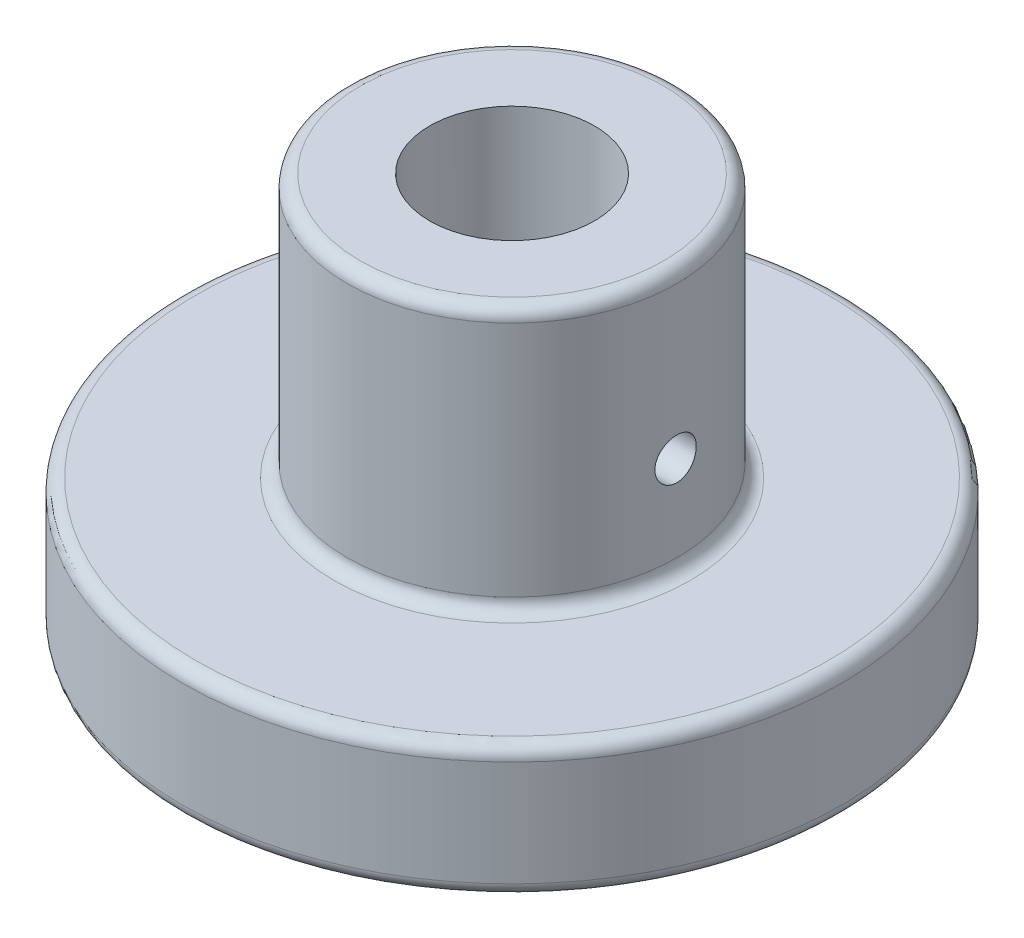
ISO-10303-21;
HEADER;
FILE_DESCRIPTION(('STEP AP214'),'2;1');
FILE_NAME('part.step','',(''),(''),'','','');
FILE_SCHEMA(('AUTOMOTIVE_DESIGN { 1 0 10303 214 1 1 1 1 }'));
ENDSEC;
DATA;
#1=APPLICATION_CONTEXT('core data for automotive mechanical design processes');
#2=APPLICATION_PROTOCOL_DEFINITION('international standard','automotive_design',2000,#1);
#3=PRODUCT_CONTEXT('',#1,'mechanical');
#4=PRODUCT('Part','Part','',(#3));
#5=PRODUCT_RELATED_PRODUCT_CATEGORY('part','',(#4));
#6=PRODUCT_DEFINITION_FORMATION('','',#4);
#7=PRODUCT_DEFINITION_CONTEXT('part definition',#1,'design');
#8=PRODUCT_DEFINITION('design','',#6,#7);
#9=PRODUCT_DEFINITION_SHAPE('','',#8);
#10=(LENGTH_UNIT() NAMED_UNIT(*) SI_UNIT(.MILLI.,.METRE.));
#11=(NAMED_UNIT(*) PLANE_ANGLE_UNIT() SI_UNIT($,.RADIAN.));
#12=(NAMED_UNIT(*) SI_UNIT($,.STERADIAN.) SOLID_ANGLE_UNIT());
#13=UNCERTAINTY_MEASURE_WITH_UNIT(LENGTH_MEASURE(1.E-05),#10,'distance_accuracy_value','');
#14=(GEOMETRIC_REPRESENTATION_CONTEXT(3) GLOBAL_UNCERTAINTY_ASSIGNED_CONTEXT((#13)) GLOBAL_UNIT_ASSIGNED_CONTEXT((#10,
#11,#12)) REPRESENTATION_CONTEXT('',''));
#15=CARTESIAN_POINT('',(0.,0.,0.));
#16=DIRECTION('',(0.,0.,1.));
#17=DIRECTION('',(1.,0.,0.));
#18=AXIS2_PLACEMENT_3D('',#15,#16,#17);
#19=CARTESIAN_POINT('',(0.,20.,0.));
#20=DIRECTION('',(0.,-1.,0.));
#21=DIRECTION('',(0.,0.,-1.));
#22=AXIS2_PLACEMENT_3D('',#19,#20,#21);
#23=CYLINDRICAL_SURFACE('',#22,50.);
#24=CARTESIAN_POINT('',(0.,18.,0.));
#25=DIRECTION('',(0.,1.,0.));
#26=DIRECTION('',(0.,0.,1.));
#27=AXIS2_PLACEMENT_3D('',#24,#25,#26);
#28=CIRCLE('',#27,50.);
#29=CARTESIAN_POINT('',(0.,18.,50.));
#30=VERTEX_POINT('',#29);
#31=EDGE_CURVE('E10',#30,#30,#28,.F.);
#32=ORIENTED_EDGE('',*,*,#31,.T.);
#33=EDGE_LOOP('',(#32));
#34=FACE_BOUND('',#33,.T.);
#35=CARTESIAN_POINT('',(0.,2.,0.));
#36=DIRECTION('',(0.,1.,0.));
#37=DIRECTION('',(0.,0.,1.));
#38=AXIS2_PLACEMENT_3D('',#35,#36,#37);
#39=CIRCLE('',#38,50.);
#40=CARTESIAN_POINT('',(0.,2.,50.));
#41=VERTEX_POINT('',#40);
#42=EDGE_CURVE('E122',#41,#41,#39,.T.);
#43=ORIENTED_EDGE('',*,*,#42,.T.);
#44=EDGE_LOOP('',(#43));
#45=FACE_BOUND('',#44,.T.);
#46=ADVANCED_FACE('F30',(#34,#45),#23,.T.);
#47=CARTESIAN_POINT('',(0.,20.,0.));
#48=DIRECTION('',(0.,1.,0.));
#49=DIRECTION('',(0.,0.,1.));
#50=AXIS2_PLACEMENT_3D('',#47,#48,#49);
#51=PLANE('',#50);
#52=CARTESIAN_POINT('',(0.,20.,0.));
#53=DIRECTION('',(0.,1.,0.));
#54=DIRECTION('',(0.,0.,1.));
#55=AXIS2_PLACEMENT_3D('',#52,#53,#54);
#56=CIRCLE('',#55,27.);
#57=CARTESIAN_POINT('',(0.,20.,27.));
#58=VERTEX_POINT('',#57);
#59=EDGE_CURVE('E47',#58,#58,#56,.F.);
#60=ORIENTED_EDGE('',*,*,#59,.T.);
#61=EDGE_LOOP('',(#60));
#62=FACE_BOUND('',#61,.T.);
#63=CARTESIAN_POINT('',(0.,20.,0.));
#64=DIRECTION('',(0.,1.,0.));
#65=DIRECTION('',(0.,0.,1.));
#66=AXIS2_PLACEMENT_3D('',#63,#64,#65);
#67=CIRCLE('',#66,48.);
#68=CARTESIAN_POINT('',(0.,20.,48.));
#69=VERTEX_POINT('',#68);
#70=EDGE_CURVE('E135',#69,#69,#67,.T.);
#71=ORIENTED_EDGE('',*,*,#70,.T.);
#72=EDGE_LOOP('',(#71));
#73=FACE_BOUND('',#72,.T.);
#74=ADVANCED_FACE('F82',(#62,#73),#51,.T.);
#75=CARTESIAN_POINT('',(0.,0.,0.));
#76=DIRECTION('',(0.,1.,0.));
#77=DIRECTION('',(0.,0.,1.));
#78=AXIS2_PLACEMENT_3D('',#75,#76,#77);
#79=PLANE('',#78);
#80=CARTESIAN_POINT('',(0.,0.,0.));
#81=DIRECTION('',(0.,1.,0.));
#82=DIRECTION('',(0.,0.,1.));
#83=AXIS2_PLACEMENT_3D('',#80,#81,#82);
#84=CIRCLE('',#83,48.);
#85=CARTESIAN_POINT('',(0.,0.,48.));
#86=VERTEX_POINT('',#85);
#87=EDGE_CURVE('E128',#86,#86,#84,.F.);
#88=ORIENTED_EDGE('',*,*,#87,.T.);
#89=EDGE_LOOP('',(#88));
#90=FACE_BOUND('',#89,.T.);
#91=ADVANCED_FACE('F86',(#90),#79,.F.);
#92=CARTESIAN_POINT('',(0.,60.,0.));
#93=DIRECTION('',(0.,1.,0.));
#94=DIRECTION('',(0.,0.,1.));
#95=AXIS2_PLACEMENT_3D('',#92,#93,#94);
#96=PLANE('',#95);
#97=CARTESIAN_POINT('',(0.,60.,0.));
#98=DIRECTION('',(0.,1.,0.));
#99=DIRECTION('',(0.,0.,1.));
#100=AXIS2_PLACEMENT_3D('',#97,#98,#99);
#101=CIRCLE('',#100,23.);
#102=CARTESIAN_POINT('',(0.,60.,23.));
#103=VERTEX_POINT('',#102);
#104=EDGE_CURVE('E42',#103,#103,#101,.T.);
#105=ORIENTED_EDGE('',*,*,#104,.T.);
#106=EDGE_LOOP('',(#105));
#107=FACE_BOUND('',#106,.T.);
#108=CARTESIAN_POINT('',(0.,60.,0.));
#109=DIRECTION('',(0.,1.,0.));
#110=DIRECTION('',(0.,0.,1.));
#111=AXIS2_PLACEMENT_3D('',#108,#109,#110);
#112=CIRCLE('',#111,12.5);
#113=CARTESIAN_POINT('',(0.,60.,12.5));
#114=VERTEX_POINT('',#113);
#115=EDGE_CURVE('E118',#114,#114,#112,.T.);
#116=ORIENTED_EDGE('',*,*,#115,.F.);
#117=EDGE_LOOP('',(#116));
#118=FACE_BOUND('',#117,.T.);
#119=ADVANCED_FACE('F80',(#107,#118),#96,.T.);
#120=CARTESIAN_POINT('',(0.,60.,0.));
#121=DIRECTION('',(0.,-1.,0.));
#122=DIRECTION('',(0.,0.,-1.));
#123=AXIS2_PLACEMENT_3D('',#120,#121,#122);
#124=CYLINDRICAL_SURFACE('',#123,25.);
#125=CARTESIAN_POINT('',(-25.,31.8637299506421,0.));
#126=CARTESIAN_POINT('',(-24.9999975452803,31.8637374001657,-0.175426504936452));
#127=CARTESIAN_POINT('',(-24.9981340342373,31.8784982357446,-0.35096250138476));
#128=CARTESIAN_POINT('',(-24.9908793713323,31.9371488896594,-0.697149568435693));
#129=CARTESIAN_POINT('',(-24.9854845402499,31.9810690893069,-0.867795350245432));
#130=CARTESIAN_POINT('',(-24.9717749693672,32.0967238030575,-1.19914013318407));
#131=CARTESIAN_POINT('',(-24.9634621993085,32.168439557288,-1.35984575850801));
#132=CARTESIAN_POINT('',(-24.9448412008388,32.3376085335069,-1.66691021248504));
#133=CARTESIAN_POINT('',(-24.934533313733,32.4350573543703,-1.81327148858773));
#134=CARTESIAN_POINT('',(-24.9130089812567,32.6535037429543,-2.0883343254205));
#135=CARTESIAN_POINT('',(-24.9017882923629,32.7746154536429,-2.21694491445447));
#136=CARTESIAN_POINT('',(-24.879737197385,33.0367046417048,-2.45207210699043));
#137=CARTESIAN_POINT('',(-24.8689068112577,33.1776831330872,-2.55858758206197));
#138=CARTESIAN_POINT('',(-24.848820795142,33.4760954692896,-2.74684001507635));
#139=CARTESIAN_POINT('',(-24.8395706310994,33.6335835063806,-2.82849170243813));
#140=CARTESIAN_POINT('',(-24.8237483632564,33.9601719535107,-2.96415419589083));
#141=CARTESIAN_POINT('',(-24.8171761571836,34.1292719197972,-3.01816605757809));
#142=CARTESIAN_POINT('',(-24.8074944588812,34.4733397870526,-3.09673918438216));
#143=CARTESIAN_POINT('',(-24.8043669092169,34.6482720868565,-3.1214540814096));
#144=CARTESIAN_POINT('',(-24.801873372192,34.999827246332,-3.14120711099796));
#145=CARTESIAN_POINT('',(-24.8025072325076,35.1764500372555,-3.13624644531432));
#146=CARTESIAN_POINT('',(-24.8074483729952,35.5253015704769,-3.09691526984952));
#147=CARTESIAN_POINT('',(-24.811734510862,35.6975497384396,-3.06271402415186));
#148=CARTESIAN_POINT('',(-24.8234642866827,36.0338424512683,-2.96613664371976));
#149=CARTESIAN_POINT('',(-24.830907989033,36.1978868287476,-2.90375993436498));
#150=CARTESIAN_POINT('',(-24.8481381320282,36.5136409970495,-2.75242043609595));
#151=CARTESIAN_POINT('',(-24.8579310364708,36.6653151809164,-2.6633841228892));
#152=CARTESIAN_POINT('',(-24.8787511714645,36.9516333011829,-2.46130542557261));
#153=CARTESIAN_POINT('',(-24.8897784588682,37.0862764525665,-2.34826193553648));
#154=CARTESIAN_POINT('',(-24.9119188275681,37.3356929195502,-2.10043985556079));
#155=CARTESIAN_POINT('',(-24.9230319715077,37.4503213216764,-1.96551537531713));
#156=CARTESIAN_POINT('',(-24.9440200274397,37.6553259774372,-1.67826356241433));
#157=CARTESIAN_POINT('',(-24.9538949365414,37.7457021744583,-1.52593618913175));
#158=CARTESIAN_POINT('',(-24.9713000794461,37.8996372036637,-1.2080906209164));
#159=CARTESIAN_POINT('',(-24.9788295166377,37.9631869271568,-1.042567968286));
#160=CARTESIAN_POINT('',(-24.9906881300489,38.061549841063,-0.703085537992048));
#161=CARTESIAN_POINT('',(-24.9950174571802,38.0963643865878,-0.52912615860266));
#162=CARTESIAN_POINT('',(-24.9999684275546,38.1360807870688,-0.178961299176743));
#163=CARTESIAN_POINT('',(-25.0006148130197,38.1411822613771,-0.00277879641978046));
#164=CARTESIAN_POINT('',(-24.9981938816775,38.1218545562449,0.347929649174142));
#165=CARTESIAN_POINT('',(-24.9951266445419,38.0974260103394,0.522455627469107));
#166=CARTESIAN_POINT('',(-24.985638535073,38.019897535035,0.864307601556272));
#167=CARTESIAN_POINT('',(-24.9792288021655,37.9668928207494,1.03165552664028));
#168=CARTESIAN_POINT('',(-24.9637733032145,37.8338156342775,1.35508717209474));
#169=CARTESIAN_POINT('',(-24.9547274470781,37.7537422369687,1.51117050725566));
#170=CARTESIAN_POINT('',(-24.9349464889529,37.568317950778,1.80853361708294));
#171=CARTESIAN_POINT('',(-24.9242028601144,37.4628379776461,1.94973232277449));
#172=CARTESIAN_POINT('',(-24.9022547591984,37.229777301844,2.21249317915113));
#173=CARTESIAN_POINT('',(-24.8910502687048,37.102195715329,2.33405454416203));
#174=CARTESIAN_POINT('',(-24.869366891182,36.8276739261348,2.55479858105875));
#175=CARTESIAN_POINT('',(-24.8588925342716,36.6806268924343,2.65384890559286));
#176=CARTESIAN_POINT('',(-24.8399299581808,36.3718665790187,2.82584478081109));
#177=CARTESIAN_POINT('',(-24.8314416989442,36.210153595182,2.89879085798901));
#178=CARTESIAN_POINT('',(-24.817443257689,35.8770783176741,3.01629345730101));
#179=CARTESIAN_POINT('',(-24.8119252626146,35.7057426613933,3.06092451580283));
#180=CARTESIAN_POINT('',(-24.8044697208662,35.3579351015948,3.12077014721831));
#181=CARTESIAN_POINT('',(-24.8025320063265,35.1814634392789,3.13598609929556));
#182=CARTESIAN_POINT('',(-24.8024613320431,34.8297099822063,3.13654416667212));
#183=CARTESIAN_POINT('',(-24.8043018905818,34.6544284863326,3.12209420869869));
#184=CARTESIAN_POINT('',(-24.8115234319591,34.308806509056,3.06417103094447));
#185=CARTESIAN_POINT('',(-24.816904415092,34.1384660280638,3.02069780875123));
#186=CARTESIAN_POINT('',(-24.8305922944013,33.8075892810286,2.90602729869227));
#187=CARTESIAN_POINT('',(-24.8388981255775,33.6470494712823,2.83484010108903));
#188=CARTESIAN_POINT('',(-24.8575015926276,33.3401604269441,2.66678284970615));
#189=CARTESIAN_POINT('',(-24.8677992541711,33.1938113752704,2.56991246493152));
#190=CARTESIAN_POINT('',(-24.8893125548508,32.9183953987768,2.3524674992347));
#191=CARTESIAN_POINT('',(-24.9005338987549,32.7894512430437,2.23173797233941));
#192=CARTESIAN_POINT('',(-24.9225798816047,32.5535726911602,1.97032499869376));
#193=CARTESIAN_POINT('',(-24.9334044264174,32.446643490213,1.82963685520542));
#194=CARTESIAN_POINT('',(-24.9534829801489,32.2574812519469,1.53168209381025));
#195=CARTESIAN_POINT('',(-24.9627308157663,32.1753443596637,1.3743540500432));
#196=CARTESIAN_POINT('',(-24.9785514169362,32.0387736678061,1.04810940658508));
#197=CARTESIAN_POINT('',(-24.9851270853614,31.9843097898319,0.879205616504962));
#198=CARTESIAN_POINT('',(-24.9932787417485,31.9176566003254,0.591191713805877));
#199=CARTESIAN_POINT('',(-24.9957869230297,31.8974632018036,0.4738971523112));
#200=CARTESIAN_POINT('',(-24.9991483778768,31.8704974023558,0.237751819229293));
#201=CARTESIAN_POINT('',(-25.0000016637667,31.8637249014834,0.118901059237818));
#202=CARTESIAN_POINT('',(-25.,31.8637299506421,0.));
#203=B_SPLINE_CURVE_WITH_KNOTS('',3,(#125,#126,#127,#128,#129,#130,#131,#132,#133,#134,#135,
#136,#137,#138,#139,#140,#141,#142,#143,#144,#145,#146,#147,#148,#149,#150,#151,#152,#153,#154,
#155,#156,#157,#158,#159,#160,#161,#162,#163,#164,#165,#166,#167,#168,#169,#170,#171,#172,#173,
#174,#175,#176,#177,#178,#179,#180,#181,#182,#183,#184,#185,#186,#187,#188,#189,#190,#191,#192,
#193,#194,#195,#196,#197,#198,#199,#200,#201,#202),.UNSPECIFIED.,.T.,.F.,(4,2,2,2,2,2,2,2,2,2,2,
2,2,2,2,2,2,2,2,2,2,2,2,2,2,2,2,2,2,2,2,2,2,2,2,2,2,2,4),(0.,0.525845203762974,1.05223915032587,
1.57827843818988,2.10422781578968,2.6327798139888,3.16135879948536,3.6917306486166,
4.22208224073245,4.74964021435073,5.27717682387973,5.80168021484545,6.32619430320104,
6.85216848100573,7.37816689385093,7.90782860416204,8.43749155088365,8.967334195588,
9.49715185221079,10.0234059269684,10.5496487117074,11.0741488080057,11.5986668318803,
12.1259081971337,12.6531706516679,13.1834571197493,13.7137328919361,14.2426069116872,
14.771456133925,15.2966113378002,15.821766585327,16.346730809875,16.8717018002881,
17.4002012586237,17.9288252924133,18.4594737531183,18.9895442000017,19.3459556634104,
19.7023644725877),.UNSPECIFIED.);
#204=CARTESIAN_POINT('',(-25.,31.8637299506421,0.));
#205=VERTEX_POINT('',#204);
#206=EDGE_CURVE('E72',#205,#205,#203,.T.);
#207=ORIENTED_EDGE('',*,*,#206,.T.);
#208=EDGE_LOOP('',(#207));
#209=FACE_BOUND('',#208,.T.);
#210=CARTESIAN_POINT('',(24.8024960473236,35.,-3.13627004935794));
#211=CARTESIAN_POINT('',(24.8024985748573,34.8245796188061,-3.13626259445184));
#212=CARTESIAN_POINT('',(24.8043771825992,34.6490497281322,-3.12150275459631));
#213=CARTESIAN_POINT('',(24.8116857566356,34.302875346109,-3.06285641500464));
#214=CARTESIAN_POINT('',(24.8171194298121,34.1322361483747,-3.01893951236692));
#215=CARTESIAN_POINT('',(24.8309132101184,33.8009052917437,-2.90329444215878));
#216=CARTESIAN_POINT('',(24.8392713264175,33.6402069529114,-2.83158519081481));
#217=CARTESIAN_POINT('',(24.857969847212,33.3331547233365,-2.66243153156534));
#218=CARTESIAN_POINT('',(24.8683099138389,33.1867983940903,-2.56499150898593));
#219=CARTESIAN_POINT('',(24.8898725321283,32.9117300346926,-2.34655403459878));
#220=CARTESIAN_POINT('',(24.9010992639212,32.7831105281521,-2.22544047176368));
#221=CARTESIAN_POINT('',(24.9231326530996,32.5479661065192,-1.96334382667631));
#222=CARTESIAN_POINT('',(24.9339392895295,32.4414422924804,-1.82235975484164));
#223=CARTESIAN_POINT('',(24.9539576541424,32.2531810891403,-1.52394246629858));
#224=CARTESIAN_POINT('',(24.9631639492998,32.171527452712,-1.36645601731429));
#225=CARTESIAN_POINT('',(24.9788983849568,32.0358609186445,-1.03987101987877));
#226=CARTESIAN_POINT('',(24.9854266255412,31.9818469880308,-0.870772905656435));
#227=CARTESIAN_POINT('',(24.9950399570438,31.9032696121641,-0.526710964940127));
#228=CARTESIAN_POINT('',(24.9981430277129,31.8785523289406,-0.351782782592816));
#229=CARTESIAN_POINT('',(25.0006177867903,31.8587931000894,-0.000235703982631887));
#230=CARTESIAN_POINT('',(24.9999896229892,31.8637499790969,0.176383125038709));
#231=CARTESIAN_POINT('',(24.995087235289,31.9030751088001,0.525251222096796));
#232=CARTESIAN_POINT('',(24.9908335223316,31.9372779090604,0.69751946882566));
#233=CARTESIAN_POINT('',(24.9791810309264,32.0338653387428,1.03385153461681));
#234=CARTESIAN_POINT('',(24.9717821923239,32.0962505071912,1.19791519668851));
#235=CARTESIAN_POINT('',(24.9546354806809,32.2476076236064,1.51369293798732));
#236=CARTESIAN_POINT('',(24.9448812982287,32.3366511393241,1.66537235717989));
#237=CARTESIAN_POINT('',(24.9241151097904,32.5387452644576,1.9516979036672));
#238=CARTESIAN_POINT('',(24.9131030457132,32.6517969828217,2.08634324369259));
#239=CARTESIAN_POINT('',(24.8909639287916,32.8996249627075,2.3357506058912));
#240=CARTESIAN_POINT('',(24.8798366062208,33.034545418777,2.45036937026334));
#241=CARTESIAN_POINT('',(24.8587958988894,33.3217857238741,2.65535648880766));
#242=CARTESIAN_POINT('',(24.8488825179838,33.474105628152,2.74572476597172));
#243=CARTESIAN_POINT('',(24.8313922175904,33.7919490416031,2.89965407209063));
#244=CARTESIAN_POINT('',(24.823816303496,33.9574781939296,2.96320357003809));
#245=CARTESIAN_POINT('',(24.8118782641492,34.2969747715799,3.06156404711679));
#246=CARTESIAN_POINT('',(24.8075159828573,34.4709417867618,3.0963764216028));
#247=CARTESIAN_POINT('',(24.8025276505037,34.8211104050542,3.13608461879718));
#248=CARTESIAN_POINT('',(24.801876418533,34.9972887984338,3.14118207419613));
#249=CARTESIAN_POINT('',(24.804317316592,35.3479880647202,3.12184779782395));
#250=CARTESIAN_POINT('',(24.8074093662428,35.522508973137,3.09741670011583));
#251=CARTESIAN_POINT('',(24.8169654490619,35.8643346705833,3.01988861652103));
#252=CARTESIAN_POINT('',(24.8234179893814,36.0316619633814,2.96688931216443));
#253=CARTESIAN_POINT('',(24.83895868888,36.3550547325211,2.8338298418453));
#254=CARTESIAN_POINT('',(24.848046941291,36.5111198102457,2.75376871862112));
#255=CARTESIAN_POINT('',(24.8678953429221,36.8084701441072,2.56836268618177));
#256=CARTESIAN_POINT('',(24.8786641264342,36.9496723856738,2.46288557936087));
#257=CARTESIAN_POINT('',(24.9006331210688,37.2124417079857,2.22982851394766));
#258=CARTESIAN_POINT('',(24.9118333490829,37.3340080189885,2.10224768928002));
#259=CARTESIAN_POINT('',(24.9334806151557,37.5547632246653,1.82772381291798));
#260=CARTESIAN_POINT('',(24.9439229586633,37.6538196077948,1.68067378046066));
#261=CARTESIAN_POINT('',(24.9628076281791,37.8258261057771,1.37190580798808));
#262=CARTESIAN_POINT('',(24.9712499947483,37.8987767500864,1.21018816553345));
#263=CARTESIAN_POINT('',(24.9851626465857,38.0162822678555,0.877115439815283));
#264=CARTESIAN_POINT('',(24.9906409344526,38.0609136562686,0.705787698551772));
#265=CARTESIAN_POINT('',(24.9980414085895,38.1207626277673,0.357996870649351));
#266=CARTESIAN_POINT('',(24.9999637564354,38.1359815473079,0.18153401771145));
#267=CARTESIAN_POINT('',(25.0000349784983,38.1365484700166,-0.170224158795383));
#268=CARTESIAN_POINT('',(24.998209661373,38.1221007751244,-0.345519182962047));
#269=CARTESIAN_POINT('',(24.9910419637677,38.0641773733552,-0.691168793068553));
#270=CARTESIAN_POINT('',(24.9856995858572,38.020701687686,-0.861523382617764));
#271=CARTESIAN_POINT('',(24.9720953922659,37.9060207102676,-1.19242912656733));
#272=CARTESIAN_POINT('',(24.9638346145556,37.8348252765243,-1.35298374268871));
#273=CARTESIAN_POINT('',(24.94530821249,37.6667469539128,-1.65989897712327));
#274=CARTESIAN_POINT('',(24.9350425636034,37.5698637507275,-1.80625942172571));
#275=CARTESIAN_POINT('',(24.9135678971934,37.3524044503582,-2.08167529799427));
#276=CARTESIAN_POINT('',(24.9023531061545,37.2316763541615,-2.21061027315041));
#277=CARTESIAN_POINT('',(24.8802903986418,36.9702700513687,-2.4464709688944));
#278=CARTESIAN_POINT('',(24.8694425696822,36.8295871268622,-2.55339146991274));
#279=CARTESIAN_POINT('',(24.8492970276431,36.5316368498114,-2.74254406763064));
#280=CARTESIAN_POINT('',(24.8400055074345,36.3743071243313,-2.82467852771783));
#281=CARTESIAN_POINT('',(24.8240972023629,36.0480589645506,-2.96124421030671));
#282=CARTESIAN_POINT('',(24.8174775122203,35.8791533527203,-3.0157055406445));
#283=CARTESIAN_POINT('',(24.8092683838036,35.591146225526,-3.08235174655145));
#284=CARTESIAN_POINT('',(24.8067414192999,35.4738607518738,-3.10254200254018));
#285=CARTESIAN_POINT('',(24.8033544009238,35.2377336119622,-3.12950362882036));
#286=CARTESIAN_POINT('',(24.8024943342761,35.1188919576367,-3.1362751019543));
#287=CARTESIAN_POINT('',(24.8024960473236,35.,-3.13627004935794));
#288=B_SPLINE_CURVE_WITH_KNOTS('',3,(#210,#211,#212,#213,#214,#215,#216,#217,#218,#219,#220,
#221,#222,#223,#224,#225,#226,#227,#228,#229,#230,#231,#232,#233,#234,#235,#236,#237,#238,#239,
#240,#241,#242,#243,#244,#245,#246,#247,#248,#249,#250,#251,#252,#253,#254,#255,#256,#257,#258,
#259,#260,#261,#262,#263,#264,#265,#266,#267,#268,#269,#270,#271,#272,#273,#274,#275,#276,#277,
#278,#279,#280,#281,#282,#283,#284,#285,#286,#287),.UNSPECIFIED.,.T.,.F.,(4,2,2,2,2,2,2,2,2,2,2,
2,2,2,2,2,2,2,2,2,2,2,2,2,2,2,2,2,2,2,2,2,2,2,2,2,2,2,4),(0.,0.5258268070109,1.05220277159244,
1.57822109780307,2.10414983187754,2.6327259088294,3.16132831900376,3.69169165620954,
4.22203517078041,4.74958131370949,5.27710656118609,5.8016670815656,6.32623763530851,
6.85222929045445,7.37824524664692,7.90788230325359,8.43752104171833,8.96738727231468,
9.49722777330487,10.0234687804596,10.5496984879065,11.0741401991186,11.5986004634253,
12.1258498643103,12.6531199287331,13.1834178508862,13.7137050173326,14.2425532463206,
14.7713774447369,15.2965720612552,15.8217662940685,16.3467739218037,16.8717879738624,
17.4002635149494,17.928864212169,18.4595207681583,18.9895987370845,19.3459829677816,
19.7023644671142),.UNSPECIFIED.);
#289=CARTESIAN_POINT('',(24.8024960473236,35.,-3.13627004935794));
#290=VERTEX_POINT('',#289);
#291=EDGE_CURVE('E67',#290,#290,#288,.T.);
#292=ORIENTED_EDGE('',*,*,#291,.T.);
#293=EDGE_LOOP('',(#292));
#294=FACE_BOUND('',#293,.T.);
#295=CARTESIAN_POINT('',(0.,22.,0.));
#296=DIRECTION('',(0.,1.,0.));
#297=DIRECTION('',(0.,0.,1.));
#298=AXIS2_PLACEMENT_3D('',#295,#296,#297);
#299=CIRCLE('',#298,25.);
#300=CARTESIAN_POINT('',(0.,22.,25.));
#301=VERTEX_POINT('',#300);
#302=EDGE_CURVE('E132',#301,#301,#299,.T.);
#303=ORIENTED_EDGE('',*,*,#302,.T.);
#304=EDGE_LOOP('',(#303));
#305=FACE_BOUND('',#304,.T.);
#306=CARTESIAN_POINT('',(0.,58.,0.));
#307=DIRECTION('',(0.,1.,0.));
#308=DIRECTION('',(0.,0.,1.));
#309=AXIS2_PLACEMENT_3D('',#306,#307,#308);
#310=CIRCLE('',#309,25.);
#311=CARTESIAN_POINT('',(0.,58.,25.));
#312=VERTEX_POINT('',#311);
#313=EDGE_CURVE('E111',#312,#312,#310,.F.);
#314=ORIENTED_EDGE('',*,*,#313,.T.);
#315=EDGE_LOOP('',(#314));
#316=FACE_BOUND('',#315,.T.);
#317=ADVANCED_FACE('F76',(#209,#294,#305,#316),#124,.T.);
#318=CARTESIAN_POINT('',(0.,60.,0.));
#319=DIRECTION('',(0.,-1.,0.));
#320=DIRECTION('',(0.,0.,-1.));
#321=AXIS2_PLACEMENT_3D('',#318,#319,#320);
#322=CYLINDRICAL_SURFACE('',#321,12.5);
#323=CARTESIAN_POINT('',(-12.1001574443269,35.,-3.13627004935794));
#324=CARTESIAN_POINT('',(-12.1001607376275,35.1731640364832,-3.13626516694266));
#325=CARTESIAN_POINT('',(-12.1039152358188,35.3463819741741,-3.12187974433946));
#326=CARTESIAN_POINT('',(-12.1184888581037,35.6878421066533,-3.0648107987474));
#327=CARTESIAN_POINT('',(-12.1293120635962,35.8560813681064,-3.022110927069));
#328=CARTESIAN_POINT('',(-12.1567218824138,36.1825956775284,-2.90988327747473));
#329=CARTESIAN_POINT('',(-12.1733010181237,36.3408833401867,-2.84039029400941));
#330=CARTESIAN_POINT('',(-12.2103453260426,36.6435711035023,-2.67665519833331));
#331=CARTESIAN_POINT('',(-12.2308106705384,36.7879705880291,-2.5824119888028));
#332=CARTESIAN_POINT('',(-12.2738292635703,37.0619834233127,-2.36962043122757));
#333=CARTESIAN_POINT('',(-12.2964160666366,37.1912435735921,-2.25062395936672));
#334=CARTESIAN_POINT('',(-12.3408416090674,37.4281963349013,-1.99266889200517));
#335=CARTESIAN_POINT('',(-12.3626802779491,37.5358869184366,-1.85370842203626));
#336=CARTESIAN_POINT('',(-12.4035203308266,37.7280901292482,-1.5573487111327));
#337=CARTESIAN_POINT('',(-12.4224775022669,37.8122555616258,-1.39971767788145));
#338=CARTESIAN_POINT('',(-12.4550356789795,37.9527614684942,-1.07198981617639));
#339=CARTESIAN_POINT('',(-12.4686374803469,38.0091060789667,-0.901894844994059));
#340=CARTESIAN_POINT('',(-12.488715152096,38.0912389926889,-0.557749836672602));
#341=CARTESIAN_POINT('',(-12.4953307178972,38.1176271401263,-0.383851247970572));
#342=CARTESIAN_POINT('',(-12.5011774122972,38.1409811708267,-0.033978026865965));
#343=CARTESIAN_POINT('',(-12.5004096402379,38.1379514342634,0.141996292573806));
#344=CARTESIAN_POINT('',(-12.4916800682513,38.1029866449825,0.486864658575193));
#345=CARTESIAN_POINT('',(-12.4838794284192,38.0716990995385,0.655829047184658));
#346=CARTESIAN_POINT('',(-12.4621483956236,37.9821478991286,0.986028378826192));
#347=CARTESIAN_POINT('',(-12.4482176750442,37.9238828023666,1.14726290823314));
#348=CARTESIAN_POINT('',(-12.4155456123624,37.7815079932,1.45912878270736));
#349=CARTESIAN_POINT('',(-12.3967617169183,37.697168298854,1.60965049400853));
#350=CARTESIAN_POINT('',(-12.3564201290743,37.5052129615571,1.8946309608987));
#351=CARTESIAN_POINT('',(-12.3348619512523,37.3975932430018,2.02908689746629));
#352=CARTESIAN_POINT('',(-12.2906270337859,37.158663487356,2.28198089610938));
#353=CARTESIAN_POINT('',(-12.2679358219727,37.0267876941795,2.39988248604171));
#354=CARTESIAN_POINT('',(-12.2245295482239,36.7448988235735,2.61201736350071));
#355=CARTESIAN_POINT('',(-12.2038145800566,36.5948848862953,2.70624952831306));
#356=CARTESIAN_POINT('',(-12.1666540858405,36.2799198829666,2.86871751189516));
#357=CARTESIAN_POINT('',(-12.1502300408174,36.1148990359798,2.93682330449654));
#358=CARTESIAN_POINT('',(-12.1237860930357,35.7752381241837,3.04415828823325));
#359=CARTESIAN_POINT('',(-12.1137648086482,35.6006001434617,3.08339370948023));
#360=CARTESIAN_POINT('',(-12.1015512374761,35.2516396618745,3.1309822806407));
#361=CARTESIAN_POINT('',(-12.0991578230934,35.0774322954062,3.14012900700534));
#362=CARTESIAN_POINT('',(-12.1019233669889,34.7299799064395,3.12945385240481));
#363=CARTESIAN_POINT('',(-12.1070816244484,34.5567347961384,3.10963465956738));
#364=CARTESIAN_POINT('',(-12.124176493511,34.2190773341154,3.04228627729476));
#365=CARTESIAN_POINT('',(-12.135999805103,34.0545663841789,2.99521991423859));
#366=CARTESIAN_POINT('',(-12.1649848609559,33.7357696139843,2.87522677158851));
#367=CARTESIAN_POINT('',(-12.1821472410837,33.5814850143102,2.80229691158485));
#368=CARTESIAN_POINT('',(-12.2202995693767,33.2841603269366,2.63098860218518));
#369=CARTESIAN_POINT('',(-12.241358396595,33.1414023833109,2.53213614092443));
#370=CARTESIAN_POINT('',(-12.2847621978889,32.874209243232,2.31238742517809));
#371=CARTESIAN_POINT('',(-12.3071073845017,32.7497770867904,2.19148752073486));
#372=CARTESIAN_POINT('',(-12.3512483719092,32.5195488404343,1.92743233138063));
#373=CARTESIAN_POINT('',(-12.3730161005872,32.4143019562241,1.78379262555052));
#374=CARTESIAN_POINT('',(-12.4129663877496,32.2294225474604,1.48041816701313));
#375=CARTESIAN_POINT('',(-12.431149133564,32.1497886843852,1.32068425595298));
#376=CARTESIAN_POINT('',(-12.4617659453103,32.0190896106852,0.99076134268356));
#377=CARTESIAN_POINT('',(-12.4742413441994,31.9678184103992,0.820657960483762));
#378=CARTESIAN_POINT('',(-12.4922188205327,31.8946827149744,0.473894803726385));
#379=CARTESIAN_POINT('',(-12.4977222541227,31.8728125008779,0.297236311113613));
#380=CARTESIAN_POINT('',(-12.5010799014178,31.8594232309137,-0.0524643641010924));
#381=CARTESIAN_POINT('',(-12.4991383222767,31.8670939309912,-0.225474031713035));
#382=CARTESIAN_POINT('',(-12.4882774140778,31.910711562995,-0.567655730329466));
#383=CARTESIAN_POINT('',(-12.4793582952883,31.9466576428427,-0.736827876819599));
#384=CARTESIAN_POINT('',(-12.4555765244917,32.0453698178176,-1.06567761599955));
#385=CARTESIAN_POINT('',(-12.4407465780811,32.1079884580535,-1.22540199048444));
#386=CARTESIAN_POINT('',(-12.4067042015989,32.2581345884307,-1.5321675490089));
#387=CARTESIAN_POINT('',(-12.3874912156536,32.3456652383562,-1.67920712105124));
#388=CARTESIAN_POINT('',(-12.3461748741191,32.5456165406613,-1.96026733215019));
#389=CARTESIAN_POINT('',(-12.324013013536,32.6585862684572,-2.09388874960866));
#390=CARTESIAN_POINT('',(-12.2795584362849,32.905144199465,-2.34055280845671));
#391=CARTESIAN_POINT('',(-12.257265687812,33.0387376319898,-2.45359021471014));
#392=CARTESIAN_POINT('',(-12.2145952871397,33.3257782494386,-2.65796779445064));
#393=CARTESIAN_POINT('',(-12.194261591934,33.4795518662496,-2.74885941037823));
#394=CARTESIAN_POINT('',(-12.158404610588,33.8006851682722,-2.9033657053608));
#395=CARTESIAN_POINT('',(-12.1428778450545,33.9680349154363,-2.96700012681041));
#396=CARTESIAN_POINT('',(-12.1208052048366,34.2792281770266,-3.05577197464083));
#397=CARTESIAN_POINT('',(-12.1131207910677,34.4215896860071,-3.08589268693136));
#398=CARTESIAN_POINT('',(-12.1027957469713,34.7092883062024,-3.12614290747967));
#399=CARTESIAN_POINT('',(-12.100154679532,34.8546251584375,-3.13627414824799));
#400=CARTESIAN_POINT('',(-12.1001574443269,35.,-3.13627004935794));
#401=B_SPLINE_CURVE_WITH_KNOTS('',3,(#323,#324,#325,#326,#327,#328,#329,#330,#331,#332,#333,
#334,#335,#336,#337,#338,#339,#340,#341,#342,#343,#344,#345,#346,#347,#348,#349,#350,#351,#352,
#353,#354,#355,#356,#357,#358,#359,#360,#361,#362,#363,#364,#365,#366,#367,#368,#369,#370,#371,
#372,#373,#374,#375,#376,#377,#378,#379,#380,#381,#382,#383,#384,#385,#386,#387,#388,#389,#390,
#391,#392,#393,#394,#395,#396,#397,#398,#399,#400),.UNSPECIFIED.,.T.,.F.,(4,2,2,2,2,2,2,2,2,2,2,
2,2,2,2,2,2,2,2,2,2,2,2,2,2,2,2,2,2,2,2,2,2,2,2,2,2,2,4),(0.,0.518958210628243,1.0382163276028,
1.55680237727474,2.07541142272836,2.60438553612866,3.13340934869041,3.66987172400356,
4.20625432212038,4.73169578024265,5.25705900399471,5.77068108266632,6.28433061467274,
6.80264650031259,7.32105320040485,7.85358966118562,8.38615137705622,8.92133019342919,
9.45639348643878,9.97722652172997,10.4980112251581,11.0101990213241,11.5224478408876,
12.044810156999,12.5672590289082,13.1028853035369,13.638483582091,14.17013911219,
14.7016912118919,15.2187691809604,15.7358315684817,16.2500718214632,16.7643773286319,
17.2910792166218,17.8179148742967,18.3546692055819,18.8910341054301,19.3267481763562,
19.7624244817822),.UNSPECIFIED.);
#402=CARTESIAN_POINT('',(-12.1001574443269,35.,-3.13627004935794));
#403=VERTEX_POINT('',#402);
#404=EDGE_CURVE('E34',#403,#403,#401,.T.);
#405=ORIENTED_EDGE('',*,*,#404,.F.);
#406=EDGE_LOOP('',(#405));
#407=FACE_BOUND('',#406,.T.);
#408=CARTESIAN_POINT('',(12.1001574443269,35.,-3.13627004935794));
#409=CARTESIAN_POINT('',(12.1001607376275,34.8268359635168,-3.13626516694266));
#410=CARTESIAN_POINT('',(12.1039152358188,34.6536180258259,-3.12187974433946));
#411=CARTESIAN_POINT('',(12.1184888581037,34.3121578933467,-3.0648107987474));
#412=CARTESIAN_POINT('',(12.1293120635962,34.1439186318936,-3.022110927069));
#413=CARTESIAN_POINT('',(12.1567218824138,33.8174043224716,-2.90988327747473));
#414=CARTESIAN_POINT('',(12.1733010181237,33.6591166598133,-2.84039029400941));
#415=CARTESIAN_POINT('',(12.2103453260426,33.3564288964977,-2.67665519833331));
#416=CARTESIAN_POINT('',(12.2308106705384,33.2120294119709,-2.5824119888028));
#417=CARTESIAN_POINT('',(12.2738292635703,32.9380165766873,-2.36962043122757));
#418=CARTESIAN_POINT('',(12.2964160666366,32.8087564264079,-2.25062395936671));
#419=CARTESIAN_POINT('',(12.3408416090674,32.5718036650987,-1.99266889200517));
#420=CARTESIAN_POINT('',(12.3626802779491,32.4641130815634,-1.85370842203626));
#421=CARTESIAN_POINT('',(12.4035203308266,32.2719098707518,-1.5573487111327));
#422=CARTESIAN_POINT('',(12.4224775022669,32.1877444383742,-1.39971767788145));
#423=CARTESIAN_POINT('',(12.4550356789795,32.0472385315058,-1.07198981617639));
#424=CARTESIAN_POINT('',(12.4686374803469,31.9908939210332,-0.901894844994059));
#425=CARTESIAN_POINT('',(12.488715152096,31.9087610073111,-0.557749836672602));
#426=CARTESIAN_POINT('',(12.4953307178972,31.8823728598737,-0.383851247970572));
#427=CARTESIAN_POINT('',(12.5011774122972,31.8590188291733,-0.033978026865965));
#428=CARTESIAN_POINT('',(12.5004096402379,31.8620485657366,0.141996292573806));
#429=CARTESIAN_POINT('',(12.4916800682513,31.8970133550175,0.486864658575193));
#430=CARTESIAN_POINT('',(12.4838794284192,31.9283009004615,0.655829047184658));
#431=CARTESIAN_POINT('',(12.4621483956236,32.0178521008714,0.986028378826192));
#432=CARTESIAN_POINT('',(12.4482176750442,32.0761171976334,1.14726290823314));
#433=CARTESIAN_POINT('',(12.4155456123624,32.2184920068,1.45912878270736));
#434=CARTESIAN_POINT('',(12.3967617169183,32.302831701146,1.60965049400853));
#435=CARTESIAN_POINT('',(12.3564201290743,32.4947870384429,1.8946309608987));
#436=CARTESIAN_POINT('',(12.3348619512523,32.6024067569982,2.02908689746629));
#437=CARTESIAN_POINT('',(12.2906270337859,32.841336512644,2.28198089610938));
#438=CARTESIAN_POINT('',(12.2679358219727,32.9732123058204,2.39988248604171));
#439=CARTESIAN_POINT('',(12.2245295482239,33.2551011764264,2.61201736350071));
#440=CARTESIAN_POINT('',(12.2038145800566,33.4051151137047,2.70624952831306));
#441=CARTESIAN_POINT('',(12.1666540858405,33.7200801170334,2.86871751189516));
#442=CARTESIAN_POINT('',(12.1502300408174,33.8851009640201,2.93682330449654));
#443=CARTESIAN_POINT('',(12.1237860930357,34.2247618758163,3.04415828823325));
#444=CARTESIAN_POINT('',(12.1137648086482,34.3993998565383,3.08339370948023));
#445=CARTESIAN_POINT('',(12.1015512374761,34.7483603381255,3.1309822806407));
#446=CARTESIAN_POINT('',(12.0991578230934,34.9225677045938,3.14012900700535));
#447=CARTESIAN_POINT('',(12.1019233669889,35.2700200935605,3.12945385240481));
#448=CARTESIAN_POINT('',(12.1070816244484,35.4432652038616,3.10963465956738));
#449=CARTESIAN_POINT('',(12.124176493511,35.7809226658846,3.04228627729476));
#450=CARTESIAN_POINT('',(12.135999805103,35.9454336158211,2.99521991423859));
#451=CARTESIAN_POINT('',(12.1649848609559,36.2642303860157,2.87522677158851));
#452=CARTESIAN_POINT('',(12.1821472410837,36.4185149856898,2.80229691158485));
#453=CARTESIAN_POINT('',(12.2202995693767,36.7158396730634,2.63098860218518));
#454=CARTESIAN_POINT('',(12.241358396595,36.8585976166891,2.53213614092443));
#455=CARTESIAN_POINT('',(12.2847621978889,37.125790756768,2.31238742517809));
#456=CARTESIAN_POINT('',(12.3071073845017,37.2502229132096,2.19148752073486));
#457=CARTESIAN_POINT('',(12.3512483719092,37.4804511595657,1.92743233138063));
#458=CARTESIAN_POINT('',(12.3730161005872,37.5856980437759,1.78379262555052));
#459=CARTESIAN_POINT('',(12.4129663877496,37.7705774525395,1.48041816701313));
#460=CARTESIAN_POINT('',(12.431149133564,37.8502113156148,1.32068425595298));
#461=CARTESIAN_POINT('',(12.4617659453103,37.9809103893148,0.99076134268356));
#462=CARTESIAN_POINT('',(12.4742413441994,38.0321815896008,0.820657960483762));
#463=CARTESIAN_POINT('',(12.4922188205327,38.1053172850256,0.473894803726385));
#464=CARTESIAN_POINT('',(12.4977222541227,38.1271874991221,0.297236311113613));
#465=CARTESIAN_POINT('',(12.5010799014178,38.1405767690863,-0.0524643641010924));
#466=CARTESIAN_POINT('',(12.4991383222767,38.1329060690087,-0.225474031713035));
#467=CARTESIAN_POINT('',(12.4882774140778,38.089288437005,-0.567655730329466));
#468=CARTESIAN_POINT('',(12.4793582952883,38.0533423571573,-0.736827876819599));
#469=CARTESIAN_POINT('',(12.4555765244917,37.9546301821824,-1.06567761599955));
#470=CARTESIAN_POINT('',(12.4407465780811,37.8920115419465,-1.22540199048444));
#471=CARTESIAN_POINT('',(12.4067042015989,37.7418654115693,-1.5321675490089));
#472=CARTESIAN_POINT('',(12.3874912156536,37.6543347616438,-1.67920712105124));
#473=CARTESIAN_POINT('',(12.3461748741191,37.4543834593387,-1.96026733215019));
#474=CARTESIAN_POINT('',(12.324013013536,37.3414137315428,-2.09388874960866));
#475=CARTESIAN_POINT('',(12.2795584362849,37.094855800535,-2.34055280845671));
#476=CARTESIAN_POINT('',(12.257265687812,36.9612623680102,-2.45359021471014));
#477=CARTESIAN_POINT('',(12.2145952871397,36.6742217505614,-2.65796779445065));
#478=CARTESIAN_POINT('',(12.194261591934,36.5204481337503,-2.74885941037823));
#479=CARTESIAN_POINT('',(12.158404610588,36.1993148317278,-2.9033657053608));
#480=CARTESIAN_POINT('',(12.1428778450545,36.0319650845637,-2.96700012681042));
#481=CARTESIAN_POINT('',(12.1208052048366,35.7207718229734,-3.05577197464083));
#482=CARTESIAN_POINT('',(12.1131207910677,35.5784103139929,-3.08589268693136));
#483=CARTESIAN_POINT('',(12.1027957469713,35.2907116937976,-3.12614290747967));
#484=CARTESIAN_POINT('',(12.100154679532,35.1453748415625,-3.13627414824799));
#485=CARTESIAN_POINT('',(12.1001574443269,35.,-3.13627004935794));
#486=B_SPLINE_CURVE_WITH_KNOTS('',3,(#408,#409,#410,#411,#412,#413,#414,#415,#416,#417,#418,
#419,#420,#421,#422,#423,#424,#425,#426,#427,#428,#429,#430,#431,#432,#433,#434,#435,#436,#437,
#438,#439,#440,#441,#442,#443,#444,#445,#446,#447,#448,#449,#450,#451,#452,#453,#454,#455,#456,
#457,#458,#459,#460,#461,#462,#463,#464,#465,#466,#467,#468,#469,#470,#471,#472,#473,#474,#475,
#476,#477,#478,#479,#480,#481,#482,#483,#484,#485),.UNSPECIFIED.,.T.,.F.,(4,2,2,2,2,2,2,2,2,2,2,
2,2,2,2,2,2,2,2,2,2,2,2,2,2,2,2,2,2,2,2,2,2,2,2,2,2,2,4),(0.,0.518958210628243,1.0382163276028,
1.55680237727474,2.07541142272836,2.60438553612867,3.13340934869041,3.66987172400356,
4.20625432212038,4.73169578024265,5.25705900399471,5.77068108266632,6.28433061467274,
6.80264650031259,7.32105320040485,7.85358966118562,8.38615137705622,8.92133019342919,
9.45639348643878,9.97722652172999,10.4980112251581,11.0101990213241,11.5224478408876,
12.044810156999,12.5672590289082,13.1028853035369,13.638483582091,14.17013911219,
14.7016912118919,15.2187691809604,15.7358315684817,16.2500718214632,16.7643773286319,
17.2910792166218,17.8179148742967,18.3546692055819,18.8910341054301,19.3267481763562,
19.7624244817822),.UNSPECIFIED.);
#487=CARTESIAN_POINT('',(12.1001574443269,35.,-3.13627004935794));
#488=VERTEX_POINT('',#487);
#489=EDGE_CURVE('E50',#488,#488,#486,.T.);
#490=ORIENTED_EDGE('',*,*,#489,.F.);
#491=EDGE_LOOP('',(#490));
#492=FACE_BOUND('',#491,.T.);
#493=ORIENTED_EDGE('',*,*,#115,.T.);
#494=EDGE_LOOP('',(#493));
#495=FACE_BOUND('',#494,.T.);
#496=CARTESIAN_POINT('',(0.,20.,0.));
#497=DIRECTION('',(0.,1.,0.));
#498=DIRECTION('',(0.,0.,1.));
#499=AXIS2_PLACEMENT_3D('',#496,#497,#498);
#500=CIRCLE('',#499,12.5);
#501=CARTESIAN_POINT('',(0.,20.,12.5));
#502=VERTEX_POINT('',#501);
#503=EDGE_CURVE('E120',#502,#502,#500,.F.);
#504=ORIENTED_EDGE('',*,*,#503,.T.);
#505=EDGE_LOOP('',(#504));
#506=FACE_BOUND('',#505,.T.);
#507=ADVANCED_FACE('F54',(#407,#492,#495,#506),#322,.F.);
#508=ORIENTED_EDGE('',*,*,#503,.F.);
#509=EDGE_LOOP('',(#508));
#510=FACE_BOUND('',#509,.T.);
#511=ADVANCED_FACE('F88',(#510),#51,.T.);
#512=CARTESIAN_POINT('',(0.,2.,0.));
#513=DIRECTION('',(0.,1.,0.));
#514=DIRECTION('',(0.,0.,1.));
#515=AXIS2_PLACEMENT_3D('',#512,#513,#514);
#516=TOROIDAL_SURFACE('',#515,48.,2.);
#517=ORIENTED_EDGE('',*,*,#87,.F.);
#518=EDGE_LOOP('',(#517));
#519=FACE_BOUND('',#518,.T.);
#520=ORIENTED_EDGE('',*,*,#42,.F.);
#521=EDGE_LOOP('',(#520));
#522=FACE_BOUND('',#521,.T.);
#523=ADVANCED_FACE('F94',(#519,#522),#516,.T.);
#524=CARTESIAN_POINT('',(0.,22.,0.));
#525=DIRECTION('',(0.,1.,0.));
#526=DIRECTION('',(0.,0.,1.));
#527=AXIS2_PLACEMENT_3D('',#524,#525,#526);
#528=TOROIDAL_SURFACE('',#527,27.,2.);
#529=ORIENTED_EDGE('',*,*,#59,.F.);
#530=EDGE_LOOP('',(#529));
#531=FACE_BOUND('',#530,.T.);
#532=ORIENTED_EDGE('',*,*,#302,.F.);
#533=EDGE_LOOP('',(#532));
#534=FACE_BOUND('',#533,.T.);
#535=ADVANCED_FACE('F97',(#531,#534),#528,.F.);
#536=CARTESIAN_POINT('',(0.,58.,0.));
#537=DIRECTION('',(0.,1.,0.));
#538=DIRECTION('',(0.,0.,1.));
#539=AXIS2_PLACEMENT_3D('',#536,#537,#538);
#540=TOROIDAL_SURFACE('',#539,23.,2.);
#541=ORIENTED_EDGE('',*,*,#313,.F.);
#542=EDGE_LOOP('',(#541));
#543=FACE_BOUND('',#542,.T.);
#544=ORIENTED_EDGE('',*,*,#104,.F.);
#545=EDGE_LOOP('',(#544));
#546=FACE_BOUND('',#545,.T.);
#547=ADVANCED_FACE('F100',(#543,#546),#540,.T.);
#548=CARTESIAN_POINT('',(0.,18.,0.));
#549=DIRECTION('',(0.,1.,0.));
#550=DIRECTION('',(0.,0.,1.));
#551=AXIS2_PLACEMENT_3D('',#548,#549,#550);
#552=TOROIDAL_SURFACE('',#551,48.,2.);
#553=ORIENTED_EDGE('',*,*,#31,.F.);
#554=EDGE_LOOP('',(#553));
#555=FACE_BOUND('',#554,.T.);
#556=ORIENTED_EDGE('',*,*,#70,.F.);
#557=EDGE_LOOP('',(#556));
#558=FACE_BOUND('',#557,.T.);
#559=ADVANCED_FACE('F32',(#555,#558),#552,.T.);
#560=CARTESIAN_POINT('',(-25.,35.,0.));
#561=DIRECTION('',(1.,0.,0.));
#562=DIRECTION('',(0.,0.,-1.));
#563=AXIS2_PLACEMENT_3D('',#560,#561,#562);
#564=CYLINDRICAL_SURFACE('',#563,3.13627004935794);
#565=ORIENTED_EDGE('',*,*,#489,.T.);
#566=EDGE_LOOP('',(#565));
#567=FACE_BOUND('',#566,.T.);
#568=ORIENTED_EDGE('',*,*,#291,.F.);
#569=EDGE_LOOP('',(#568));
#570=FACE_BOUND('',#569,.T.);
#571=ADVANCED_FACE('F60',(#567,#570),#564,.F.);
#572=ORIENTED_EDGE('',*,*,#404,.T.);
#573=EDGE_LOOP('',(#572));
#574=FACE_BOUND('',#573,.T.);
#575=ORIENTED_EDGE('',*,*,#206,.F.);
#576=EDGE_LOOP('',(#575));
#577=FACE_BOUND('',#576,.T.);
#578=ADVANCED_FACE('F57',(#574,#577),#564,.F.);
#579=CLOSED_SHELL('',(#46,#74,#91,#119,#317,#507,#511,#523,#535,#547,#559,#571,#578));
#580=MANIFOLD_SOLID_BREP('B2',#579);
#581=ADVANCED_BREP_SHAPE_REPRESENTATION('',(#18,#580),#14);
#582=SHAPE_DEFINITION_REPRESENTATION(#9,#581);
ENDSEC;
END-ISO-10303-21;
